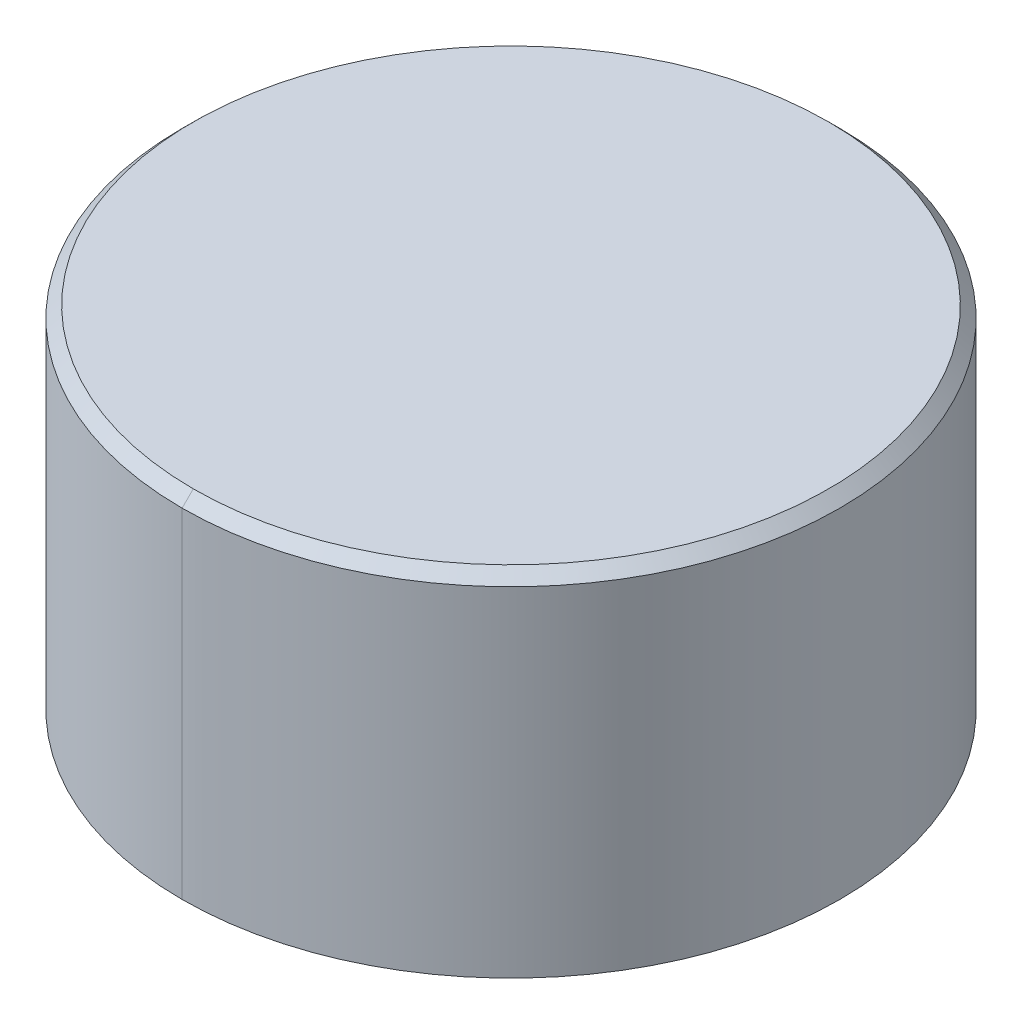
ISO-10303-21;
HEADER;
FILE_DESCRIPTION(('STEP AP214'),'2;1');
FILE_NAME('part.step','',(''),(''),'','','');
FILE_SCHEMA(('AUTOMOTIVE_DESIGN { 1 0 10303 214 1 1 1 1 }'));
ENDSEC;
DATA;
#1=APPLICATION_CONTEXT('core data for automotive mechanical design processes');
#2=APPLICATION_PROTOCOL_DEFINITION('international standard','automotive_design',2000,#1);
#3=PRODUCT_CONTEXT('',#1,'mechanical');
#4=PRODUCT('Part','Part','',(#3));
#5=PRODUCT_RELATED_PRODUCT_CATEGORY('part','',(#4));
#6=PRODUCT_DEFINITION_FORMATION('','',#4);
#7=PRODUCT_DEFINITION_CONTEXT('part definition',#1,'design');
#8=PRODUCT_DEFINITION('design','',#6,#7);
#9=PRODUCT_DEFINITION_SHAPE('','',#8);
#10=(LENGTH_UNIT() NAMED_UNIT(*) SI_UNIT(.MILLI.,.METRE.));
#11=(NAMED_UNIT(*) PLANE_ANGLE_UNIT() SI_UNIT($,.RADIAN.));
#12=(NAMED_UNIT(*) SI_UNIT($,.STERADIAN.) SOLID_ANGLE_UNIT());
#13=UNCERTAINTY_MEASURE_WITH_UNIT(LENGTH_MEASURE(1.E-05),#10,'distance_accuracy_value','');
#14=(GEOMETRIC_REPRESENTATION_CONTEXT(3) GLOBAL_UNCERTAINTY_ASSIGNED_CONTEXT((#13)) GLOBAL_UNIT_ASSIGNED_CONTEXT((#10,
#11,#12)) REPRESENTATION_CONTEXT('',''));
#15=CARTESIAN_POINT('',(0.,0.,0.));
#16=DIRECTION('',(0.,0.,1.));
#17=DIRECTION('',(1.,0.,0.));
#18=AXIS2_PLACEMENT_3D('',#15,#16,#17);
#19=CARTESIAN_POINT('',(0.,6.2992,0.));
#20=DIRECTION('',(0.,-1.,0.));
#21=DIRECTION('',(0.,0.,-1.));
#22=AXIS2_PLACEMENT_3D('',#19,#20,#21);
#23=PLANE('',#22);
#24=CARTESIAN_POINT('',(0.,6.2992,0.));
#25=DIRECTION('',(0.,-1.,0.));
#26=DIRECTION('',(0.,0.,-1.));
#27=AXIS2_PLACEMENT_3D('',#24,#25,#26);
#28=CIRCLE('',#27,3.6195);
#29=CARTESIAN_POINT('',(0.,6.2992,3.6195));
#30=VERTEX_POINT('',#29);
#31=CARTESIAN_POINT('',(0.,6.2992,-3.6195));
#32=VERTEX_POINT('',#31);
#33=EDGE_CURVE('E11',#30,#32,#28,.T.);
#34=ORIENTED_EDGE('',*,*,#33,.F.);
#35=CARTESIAN_POINT('',(0.,6.2992,0.));
#36=DIRECTION('',(0.,-1.,0.));
#37=DIRECTION('',(0.,0.,-1.));
#38=AXIS2_PLACEMENT_3D('',#35,#36,#37);
#39=CIRCLE('',#38,3.6195);
#40=EDGE_CURVE('E25',#32,#30,#39,.T.);
#41=ORIENTED_EDGE('',*,*,#40,.F.);
#42=EDGE_LOOP('',(#34,#41));
#43=FACE_BOUND('',#42,.T.);
#44=ADVANCED_FACE('F17',(#43),#23,.F.);
#45=CARTESIAN_POINT('',(0.,6.2992,0.));
#46=DIRECTION('',(0.,-1.,0.));
#47=DIRECTION('',(-1.,0.,0.));
#48=AXIS2_PLACEMENT_3D('',#45,#46,#47);
#49=CONICAL_SURFACE('',#48,3.6195,0.785398163397448);
#50=DIRECTION('',(0.,-0.70710678118655,0.707106781186545));
#51=VECTOR('',#50,1.);
#52=CARTESIAN_POINT('',(0.,6.2992,3.6195));
#53=LINE('',#52,#51);
#54=CARTESIAN_POINT('',(0.,6.1722,3.7465));
#55=VERTEX_POINT('',#54);
#56=EDGE_CURVE('E150',#30,#55,#53,.T.);
#57=ORIENTED_EDGE('',*,*,#56,.T.);
#58=CARTESIAN_POINT('',(0.,6.1722,0.));
#59=DIRECTION('',(0.,-1.,0.));
#60=DIRECTION('',(0.,0.,-1.));
#61=AXIS2_PLACEMENT_3D('',#58,#59,#60);
#62=CIRCLE('',#61,3.7465);
#63=CARTESIAN_POINT('',(0.,6.1722,-3.7465));
#64=VERTEX_POINT('',#63);
#65=EDGE_CURVE('E145',#64,#55,#62,.T.);
#66=ORIENTED_EDGE('',*,*,#65,.F.);
#67=DIRECTION('',(0.,-0.70710678118655,-0.707106781186545));
#68=VECTOR('',#67,1.);
#69=CARTESIAN_POINT('',(0.,6.2992,-3.6195));
#70=LINE('',#69,#68);
#71=EDGE_CURVE('E140',#32,#64,#70,.T.);
#72=ORIENTED_EDGE('',*,*,#71,.F.);
#73=ORIENTED_EDGE('',*,*,#40,.T.);
#74=EDGE_LOOP('',(#57,#66,#72,#73));
#75=FACE_BOUND('',#74,.T.);
#76=ADVANCED_FACE('F159',(#75),#49,.T.);
#77=CARTESIAN_POINT('',(0.,6.2992,0.));
#78=DIRECTION('',(0.,-1.,0.));
#79=DIRECTION('',(1.,0.,0.));
#80=AXIS2_PLACEMENT_3D('',#77,#78,#79);
#81=CONICAL_SURFACE('',#80,3.6195,0.785398163397448);
#82=ORIENTED_EDGE('',*,*,#56,.F.);
#83=ORIENTED_EDGE('',*,*,#33,.T.);
#84=ORIENTED_EDGE('',*,*,#71,.T.);
#85=CARTESIAN_POINT('',(0.,6.1722,0.));
#86=DIRECTION('',(0.,-1.,0.));
#87=DIRECTION('',(0.,0.,-1.));
#88=AXIS2_PLACEMENT_3D('',#85,#86,#87);
#89=CIRCLE('',#88,3.7465);
#90=EDGE_CURVE('E135',#55,#64,#89,.T.);
#91=ORIENTED_EDGE('',*,*,#90,.F.);
#92=EDGE_LOOP('',(#82,#83,#84,#91));
#93=FACE_BOUND('',#92,.T.);
#94=ADVANCED_FACE('F162',(#93),#81,.T.);
#95=CARTESIAN_POINT('',(0.,5.4102,0.));
#96=DIRECTION('',(0.,-1.,0.));
#97=DIRECTION('',(1.,0.,0.));
#98=AXIS2_PLACEMENT_3D('',#95,#96,#97);
#99=CYLINDRICAL_SURFACE('',#98,3.7465);
#100=DIRECTION('',(0.,-1.,0.));
#101=VECTOR('',#100,1.);
#102=CARTESIAN_POINT('',(0.,6.1722,3.7465));
#103=LINE('',#102,#101);
#104=CARTESIAN_POINT('',(0.,2.3114,3.7465));
#105=VERTEX_POINT('',#104);
#106=EDGE_CURVE('E130',#55,#105,#103,.T.);
#107=ORIENTED_EDGE('',*,*,#106,.F.);
#108=ORIENTED_EDGE('',*,*,#90,.T.);
#109=DIRECTION('',(0.,-1.,0.));
#110=VECTOR('',#109,1.);
#111=CARTESIAN_POINT('',(0.,6.1722,-3.7465));
#112=LINE('',#111,#110);
#113=CARTESIAN_POINT('',(0.,2.3114,-3.7465));
#114=VERTEX_POINT('',#113);
#115=EDGE_CURVE('E126',#64,#114,#112,.T.);
#116=ORIENTED_EDGE('',*,*,#115,.T.);
#117=CARTESIAN_POINT('',(0.,2.3114,0.));
#118=DIRECTION('',(0.,-1.,0.));
#119=DIRECTION('',(0.,0.,-1.));
#120=AXIS2_PLACEMENT_3D('',#117,#118,#119);
#121=CIRCLE('',#120,3.7465);
#122=EDGE_CURVE('E121',#105,#114,#121,.T.);
#123=ORIENTED_EDGE('',*,*,#122,.F.);
#124=EDGE_LOOP('',(#107,#108,#116,#123));
#125=FACE_BOUND('',#124,.T.);
#126=ADVANCED_FACE('F166',(#125),#99,.T.);
#127=CARTESIAN_POINT('',(3.7465,2.3114,0.));
#128=DIRECTION('',(0.,1.,0.));
#129=DIRECTION('',(0.,0.,1.));
#130=AXIS2_PLACEMENT_3D('',#127,#128,#129);
#131=PLANE('',#130);
#132=CARTESIAN_POINT('',(0.,2.3114,0.));
#133=DIRECTION('',(0.,-1.,0.));
#134=DIRECTION('',(0.,0.,-1.));
#135=AXIS2_PLACEMENT_3D('',#132,#133,#134);
#136=CIRCLE('',#135,1.397);
#137=CARTESIAN_POINT('',(0.,2.3114,1.397));
#138=VERTEX_POINT('',#137);
#139=CARTESIAN_POINT('',(0.,2.3114,-1.397));
#140=VERTEX_POINT('',#139);
#141=EDGE_CURVE('E116',#138,#140,#136,.T.);
#142=ORIENTED_EDGE('',*,*,#141,.F.);
#143=CARTESIAN_POINT('',(0.,2.3114,0.));
#144=DIRECTION('',(0.,-1.,0.));
#145=DIRECTION('',(0.,0.,-1.));
#146=AXIS2_PLACEMENT_3D('',#143,#144,#145);
#147=CIRCLE('',#146,1.397);
#148=EDGE_CURVE('E111',#140,#138,#147,.T.);
#149=ORIENTED_EDGE('',*,*,#148,.F.);
#150=EDGE_LOOP('',(#142,#149));
#151=FACE_BOUND('',#150,.T.);
#152=CARTESIAN_POINT('',(0.,2.3114,0.));
#153=DIRECTION('',(0.,-1.,0.));
#154=DIRECTION('',(0.,0.,-1.));
#155=AXIS2_PLACEMENT_3D('',#152,#153,#154);
#156=CIRCLE('',#155,3.7465);
#157=EDGE_CURVE('E106',#114,#105,#156,.T.);
#158=ORIENTED_EDGE('',*,*,#157,.T.);
#159=ORIENTED_EDGE('',*,*,#122,.T.);
#160=EDGE_LOOP('',(#158,#159));
#161=FACE_BOUND('',#160,.T.);
#162=ADVANCED_FACE('F171',(#151,#161),#131,.F.);
#163=CARTESIAN_POINT('',(0.,5.4102,0.));
#164=DIRECTION('',(0.,-1.,0.));
#165=DIRECTION('',(-1.,0.,-5.89359733408555E-10));
#166=AXIS2_PLACEMENT_3D('',#163,#164,#165);
#167=CYLINDRICAL_SURFACE('',#166,3.7465);
#168=ORIENTED_EDGE('',*,*,#106,.T.);
#169=ORIENTED_EDGE('',*,*,#157,.F.);
#170=ORIENTED_EDGE('',*,*,#115,.F.);
#171=ORIENTED_EDGE('',*,*,#65,.T.);
#172=EDGE_LOOP('',(#168,#169,#170,#171));
#173=FACE_BOUND('',#172,.T.);
#174=ADVANCED_FACE('F169',(#173),#167,.T.);
#175=CARTESIAN_POINT('',(0.,5.4102,0.));
#176=DIRECTION('',(0.,-1.,0.));
#177=DIRECTION('',(-1.,0.,0.));
#178=AXIS2_PLACEMENT_3D('',#175,#176,#177);
#179=CYLINDRICAL_SURFACE('',#178,1.397);
#180=DIRECTION('',(0.,-1.,0.));
#181=VECTOR('',#180,1.);
#182=CARTESIAN_POINT('',(0.,5.2832,1.397));
#183=LINE('',#182,#181);
#184=CARTESIAN_POINT('',(0.,5.2832,1.397));
#185=VERTEX_POINT('',#184);
#186=EDGE_CURVE('E101',#185,#138,#183,.T.);
#187=ORIENTED_EDGE('',*,*,#186,.F.);
#188=CARTESIAN_POINT('',(0.,5.2832,0.));
#189=DIRECTION('',(0.,-1.,0.));
#190=DIRECTION('',(0.,0.,-1.));
#191=AXIS2_PLACEMENT_3D('',#188,#189,#190);
#192=CIRCLE('',#191,1.397);
#193=CARTESIAN_POINT('',(0.,5.2832,-1.397));
#194=VERTEX_POINT('',#193);
#195=EDGE_CURVE('E83',#194,#185,#192,.T.);
#196=ORIENTED_EDGE('',*,*,#195,.F.);
#197=DIRECTION('',(0.,-1.,0.));
#198=VECTOR('',#197,1.);
#199=CARTESIAN_POINT('',(0.,5.2832,-1.397));
#200=LINE('',#199,#198);
#201=EDGE_CURVE('E86',#194,#140,#200,.T.);
#202=ORIENTED_EDGE('',*,*,#201,.T.);
#203=ORIENTED_EDGE('',*,*,#148,.T.);
#204=EDGE_LOOP('',(#187,#196,#202,#203));
#205=FACE_BOUND('',#204,.T.);
#206=ADVANCED_FACE('F180',(#205),#179,.F.);
#207=CARTESIAN_POINT('',(0.,5.4102,0.));
#208=DIRECTION('',(0.,-1.,0.));
#209=DIRECTION('',(1.,0.,0.));
#210=AXIS2_PLACEMENT_3D('',#207,#208,#209);
#211=CYLINDRICAL_SURFACE('',#210,1.397);
#212=ORIENTED_EDGE('',*,*,#186,.T.);
#213=ORIENTED_EDGE('',*,*,#141,.T.);
#214=ORIENTED_EDGE('',*,*,#201,.F.);
#215=CARTESIAN_POINT('',(0.,5.2832,0.));
#216=DIRECTION('',(0.,-1.,0.));
#217=DIRECTION('',(0.,0.,-1.));
#218=AXIS2_PLACEMENT_3D('',#215,#216,#217);
#219=CIRCLE('',#218,1.397);
#220=EDGE_CURVE('E84',#185,#194,#219,.T.);
#221=ORIENTED_EDGE('',*,*,#220,.F.);
#222=EDGE_LOOP('',(#212,#213,#214,#221));
#223=FACE_BOUND('',#222,.T.);
#224=ADVANCED_FACE('F224',(#223),#211,.F.);
#225=CARTESIAN_POINT('',(0.,5.2832,0.));
#226=DIRECTION('',(0.,-1.,0.));
#227=DIRECTION('',(1.,0.,0.));
#228=AXIS2_PLACEMENT_3D('',#225,#226,#227);
#229=CONICAL_SURFACE('',#228,1.397,0.78539816339745);
#230=DIRECTION('',(0.,-0.707106781186546,0.707106781186549));
#231=VECTOR('',#230,1.);
#232=CARTESIAN_POINT('',(0.,5.4102,1.27));
#233=LINE('',#232,#231);
#234=CARTESIAN_POINT('',(0.,5.4102,1.27));
#235=VERTEX_POINT('',#234);
#236=EDGE_CURVE('E71',#235,#185,#233,.T.);
#237=ORIENTED_EDGE('',*,*,#236,.T.);
#238=ORIENTED_EDGE('',*,*,#220,.T.);
#239=DIRECTION('',(0.,-0.707106781186546,-0.707106781186549));
#240=VECTOR('',#239,1.);
#241=CARTESIAN_POINT('',(0.,5.4102,-1.27));
#242=LINE('',#241,#240);
#243=CARTESIAN_POINT('',(0.,5.4102,-1.27));
#244=VERTEX_POINT('',#243);
#245=EDGE_CURVE('E74',#244,#194,#242,.T.);
#246=ORIENTED_EDGE('',*,*,#245,.F.);
#247=CARTESIAN_POINT('',(0.,5.4102,0.));
#248=DIRECTION('',(0.,-1.,0.));
#249=DIRECTION('',(0.,0.,-1.));
#250=AXIS2_PLACEMENT_3D('',#247,#248,#249);
#251=CIRCLE('',#250,1.27);
#252=EDGE_CURVE('E66',#235,#244,#251,.T.);
#253=ORIENTED_EDGE('',*,*,#252,.F.);
#254=EDGE_LOOP('',(#237,#238,#246,#253));
#255=FACE_BOUND('',#254,.T.);
#256=ADVANCED_FACE('F68',(#255),#229,.F.);
#257=CARTESIAN_POINT('',(1.27,5.4102,0.));
#258=DIRECTION('',(0.,1.,0.));
#259=DIRECTION('',(0.,0.,1.));
#260=AXIS2_PLACEMENT_3D('',#257,#258,#259);
#261=PLANE('',#260);
#262=CARTESIAN_POINT('',(0.,5.4102,0.));
#263=DIRECTION('',(0.,-1.,0.));
#264=DIRECTION('',(0.,0.,-1.));
#265=AXIS2_PLACEMENT_3D('',#262,#263,#264);
#266=CIRCLE('',#265,1.27);
#267=EDGE_CURVE('E77',#244,#235,#266,.T.);
#268=ORIENTED_EDGE('',*,*,#267,.T.);
#269=ORIENTED_EDGE('',*,*,#252,.T.);
#270=EDGE_LOOP('',(#268,#269));
#271=FACE_BOUND('',#270,.T.);
#272=ADVANCED_FACE('F79',(#271),#261,.F.);
#273=CARTESIAN_POINT('',(0.,5.2832,0.));
#274=DIRECTION('',(0.,-1.,0.));
#275=DIRECTION('',(-1.,0.,0.));
#276=AXIS2_PLACEMENT_3D('',#273,#274,#275);
#277=CONICAL_SURFACE('',#276,1.397,0.78539816339745);
#278=ORIENTED_EDGE('',*,*,#236,.F.);
#279=ORIENTED_EDGE('',*,*,#267,.F.);
#280=ORIENTED_EDGE('',*,*,#245,.T.);
#281=ORIENTED_EDGE('',*,*,#195,.T.);
#282=EDGE_LOOP('',(#278,#279,#280,#281));
#283=FACE_BOUND('',#282,.T.);
#284=ADVANCED_FACE('F82',(#283),#277,.F.);
#285=CLOSED_SHELL('',(#44,#76,#94,#126,#162,#174,#206,#224,#256,#272,#284));
#286=MANIFOLD_SOLID_BREP('B1',#285);
#287=ADVANCED_BREP_SHAPE_REPRESENTATION('',(#18,#286),#14);
#288=SHAPE_DEFINITION_REPRESENTATION(#9,#287);
ENDSEC;
END-ISO-10303-21;
